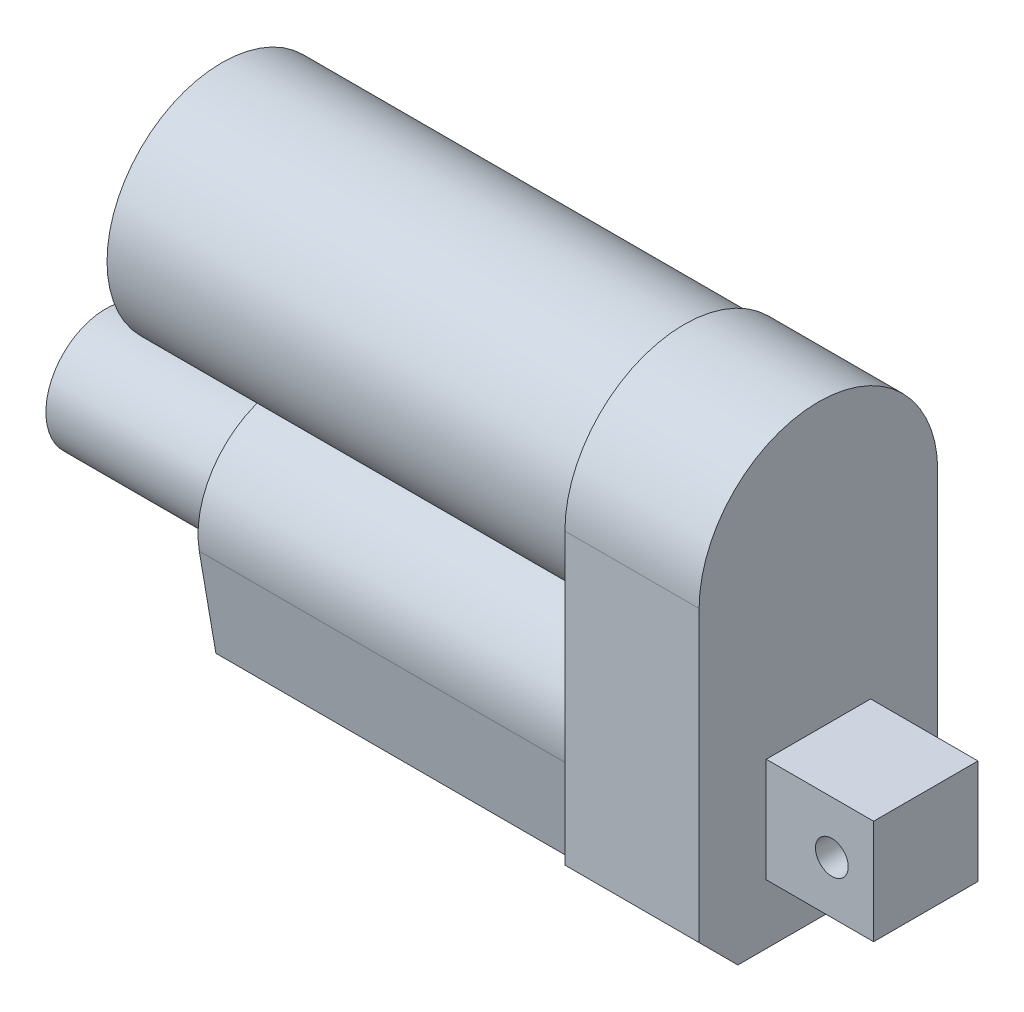
ISO-10303-21;
HEADER;
FILE_DESCRIPTION(('STEP AP214'),'2;1');
FILE_NAME('part.step','',(''),(''),'','','');
FILE_SCHEMA(('AUTOMOTIVE_DESIGN { 1 0 10303 214 1 1 1 1 }'));
ENDSEC;
DATA;
#1=APPLICATION_CONTEXT('core data for automotive mechanical design processes');
#2=APPLICATION_PROTOCOL_DEFINITION('international standard','automotive_design',2000,#1);
#3=PRODUCT_CONTEXT('',#1,'mechanical');
#4=PRODUCT('Part','Part','',(#3));
#5=PRODUCT_RELATED_PRODUCT_CATEGORY('part','',(#4));
#6=PRODUCT_DEFINITION_FORMATION('','',#4);
#7=PRODUCT_DEFINITION_CONTEXT('part definition',#1,'design');
#8=PRODUCT_DEFINITION('design','',#6,#7);
#9=PRODUCT_DEFINITION_SHAPE('','',#8);
#10=(LENGTH_UNIT() NAMED_UNIT(*) SI_UNIT(.MILLI.,.METRE.));
#11=(NAMED_UNIT(*) PLANE_ANGLE_UNIT() SI_UNIT($,.RADIAN.));
#12=(NAMED_UNIT(*) SI_UNIT($,.STERADIAN.) SOLID_ANGLE_UNIT());
#13=UNCERTAINTY_MEASURE_WITH_UNIT(LENGTH_MEASURE(1.E-05),#10,'distance_accuracy_value','');
#14=(GEOMETRIC_REPRESENTATION_CONTEXT(3) GLOBAL_UNCERTAINTY_ASSIGNED_CONTEXT((#13)) GLOBAL_UNIT_ASSIGNED_CONTEXT((#10,
#11,#12)) REPRESENTATION_CONTEXT('',''));
#15=CARTESIAN_POINT('',(0.,0.,0.));
#16=DIRECTION('',(0.,0.,1.));
#17=DIRECTION('',(1.,0.,0.));
#18=AXIS2_PLACEMENT_3D('',#15,#16,#17);
#19=CARTESIAN_POINT('',(0.,0.,0.));
#20=DIRECTION('',(1.,0.,0.));
#21=DIRECTION('',(0.,0.,-1.));
#22=AXIS2_PLACEMENT_3D('',#19,#20,#21);
#23=PLANE('',#22);
#24=CARTESIAN_POINT('',(0.,36.25,0.));
#25=DIRECTION('',(1.,0.,0.));
#26=DIRECTION('',(0.,0.,-1.));
#27=AXIS2_PLACEMENT_3D('',#24,#25,#26);
#28=CIRCLE('',#27,19.25);
#29=CARTESIAN_POINT('',(0.,36.25,-19.25));
#30=VERTEX_POINT('',#29);
#31=EDGE_CURVE('E39',#30,#30,#28,.F.);
#32=ORIENTED_EDGE('',*,*,#31,.F.);
#33=EDGE_LOOP('',(#32));
#34=FACE_BOUND('',#33,.T.);
#35=DIRECTION('',(0.,-0.985576396125463,0.169231106479704));
#36=VECTOR('',#35,1.);
#37=CARTESIAN_POINT('',(0.,-2.53846659719557,-14.7836459418819));
#38=LINE('',#37,#36);
#39=CARTESIAN_POINT('',(0.,-2.53846659719557,-14.7836459418819));
#40=VERTEX_POINT('',#39);
#41=CARTESIAN_POINT('',(0.,-18.75,-12.));
#42=VERTEX_POINT('',#41);
#43=EDGE_CURVE('E51',#40,#42,#38,.T.);
#44=ORIENTED_EDGE('',*,*,#43,.F.);
#45=CARTESIAN_POINT('',(0.,0.,0.));
#46=DIRECTION('',(-1.,0.,0.));
#47=DIRECTION('',(0.,0.,1.));
#48=AXIS2_PLACEMENT_3D('',#45,#46,#47);
#49=CIRCLE('',#48,15.);
#50=CARTESIAN_POINT('',(0.,-2.53846659719556,14.7836459418819));
#51=VERTEX_POINT('',#50);
#52=EDGE_CURVE('E286',#51,#40,#49,.T.);
#53=ORIENTED_EDGE('',*,*,#52,.F.);
#54=DIRECTION('',(0.,0.985576396125463,0.169231106479704));
#55=VECTOR('',#54,1.);
#56=CARTESIAN_POINT('',(0.,-2.53846659719556,14.7836459418819));
#57=LINE('',#56,#55);
#58=CARTESIAN_POINT('',(0.,-18.75,12.));
#59=VERTEX_POINT('',#58);
#60=EDGE_CURVE('E285',#59,#51,#57,.T.);
#61=ORIENTED_EDGE('',*,*,#60,.F.);
#62=DIRECTION('',(0.,0.,-1.));
#63=VECTOR('',#62,1.);
#64=CARTESIAN_POINT('',(0.,-18.75,0.));
#65=LINE('',#64,#63);
#66=CARTESIAN_POINT('',(0.,-18.75,13.5));
#67=VERTEX_POINT('',#66);
#68=EDGE_CURVE('E160',#67,#59,#65,.T.);
#69=ORIENTED_EDGE('',*,*,#68,.F.);
#70=DIRECTION('',(0.,-0.707106781186546,-0.707106781186549));
#71=VECTOR('',#70,1.);
#72=CARTESIAN_POINT('',(0.,-16.125,16.125));
#73=LINE('',#72,#71);
#74=CARTESIAN_POINT('',(0.,-12.25,20.));
#75=VERTEX_POINT('',#74);
#76=EDGE_CURVE('E221',#75,#67,#73,.T.);
#77=ORIENTED_EDGE('',*,*,#76,.F.);
#78=DIRECTION('',(0.,-1.,0.));
#79=VECTOR('',#78,1.);
#80=CARTESIAN_POINT('',(0.,0.,20.));
#81=LINE('',#80,#79);
#82=CARTESIAN_POINT('',(0.,36.25,20.));
#83=VERTEX_POINT('',#82);
#84=EDGE_CURVE('E219',#83,#75,#81,.T.);
#85=ORIENTED_EDGE('',*,*,#84,.F.);
#86=CARTESIAN_POINT('',(0.,36.25,0.));
#87=DIRECTION('',(1.,0.,0.));
#88=DIRECTION('',(0.,0.,-1.));
#89=AXIS2_PLACEMENT_3D('',#86,#87,#88);
#90=CIRCLE('',#89,20.);
#91=CARTESIAN_POINT('',(0.,36.25,-20.));
#92=VERTEX_POINT('',#91);
#93=EDGE_CURVE('E200',#92,#83,#90,.T.);
#94=ORIENTED_EDGE('',*,*,#93,.F.);
#95=DIRECTION('',(0.,1.,0.));
#96=VECTOR('',#95,1.);
#97=CARTESIAN_POINT('',(0.,0.,-20.));
#98=LINE('',#97,#96);
#99=CARTESIAN_POINT('',(0.,-12.25,-20.));
#100=VERTEX_POINT('',#99);
#101=EDGE_CURVE('E205',#100,#92,#98,.T.);
#102=ORIENTED_EDGE('',*,*,#101,.F.);
#103=DIRECTION('',(0.,-0.707106781186546,0.707106781186549));
#104=VECTOR('',#103,1.);
#105=CARTESIAN_POINT('',(0.,-16.125,-16.125));
#106=LINE('',#105,#104);
#107=CARTESIAN_POINT('',(0.,-18.75,-13.5));
#108=VERTEX_POINT('',#107);
#109=EDGE_CURVE('E224',#100,#108,#106,.T.);
#110=ORIENTED_EDGE('',*,*,#109,.T.);
#111=EDGE_CURVE('E56',#42,#108,#65,.T.);
#112=ORIENTED_EDGE('',*,*,#111,.F.);
#113=EDGE_LOOP('',(#44,#53,#61,#69,#77,#85,#94,#102,#110,#112));
#114=FACE_BOUND('',#113,.T.);
#115=ADVANCED_FACE('F35',(#34,#114),#23,.F.);
#116=CARTESIAN_POINT('',(22.5,0.,0.));
#117=DIRECTION('',(1.,0.,0.));
#118=DIRECTION('',(0.,0.,-1.));
#119=AXIS2_PLACEMENT_3D('',#116,#117,#118);
#120=PLANE('',#119);
#121=CARTESIAN_POINT('',(22.5,36.25,0.));
#122=DIRECTION('',(1.,0.,0.));
#123=DIRECTION('',(0.,0.,-1.));
#124=AXIS2_PLACEMENT_3D('',#121,#122,#123);
#125=CIRCLE('',#124,20.);
#126=CARTESIAN_POINT('',(22.5,36.25,-20.));
#127=VERTEX_POINT('',#126);
#128=CARTESIAN_POINT('',(22.5,36.25,20.));
#129=VERTEX_POINT('',#128);
#130=EDGE_CURVE('E201',#127,#129,#125,.T.);
#131=ORIENTED_EDGE('',*,*,#130,.T.);
#132=DIRECTION('',(0.,-1.,0.));
#133=VECTOR('',#132,1.);
#134=CARTESIAN_POINT('',(22.5,0.,20.));
#135=LINE('',#134,#133);
#136=CARTESIAN_POINT('',(22.5,-12.25,20.));
#137=VERTEX_POINT('',#136);
#138=EDGE_CURVE('E204',#129,#137,#135,.T.);
#139=ORIENTED_EDGE('',*,*,#138,.T.);
#140=DIRECTION('',(0.,-0.707106781186546,-0.707106781186549));
#141=VECTOR('',#140,1.);
#142=CARTESIAN_POINT('',(22.5,-16.125,16.125));
#143=LINE('',#142,#141);
#144=CARTESIAN_POINT('',(22.5,-18.75,13.5));
#145=VERTEX_POINT('',#144);
#146=EDGE_CURVE('E207',#137,#145,#143,.T.);
#147=ORIENTED_EDGE('',*,*,#146,.T.);
#148=DIRECTION('',(0.,0.,-1.));
#149=VECTOR('',#148,1.);
#150=CARTESIAN_POINT('',(22.5,-18.75,0.));
#151=LINE('',#150,#149);
#152=CARTESIAN_POINT('',(22.5,-18.75,-13.5));
#153=VERTEX_POINT('',#152);
#154=EDGE_CURVE('E209',#145,#153,#151,.T.);
#155=ORIENTED_EDGE('',*,*,#154,.T.);
#156=DIRECTION('',(0.,-0.707106781186546,0.707106781186549));
#157=VECTOR('',#156,1.);
#158=CARTESIAN_POINT('',(22.5,-16.125,-16.125));
#159=LINE('',#158,#157);
#160=CARTESIAN_POINT('',(22.5,-12.25,-20.));
#161=VERTEX_POINT('',#160);
#162=EDGE_CURVE('E211',#161,#153,#159,.T.);
#163=ORIENTED_EDGE('',*,*,#162,.F.);
#164=DIRECTION('',(0.,1.,0.));
#165=VECTOR('',#164,1.);
#166=CARTESIAN_POINT('',(22.5,0.,-20.));
#167=LINE('',#166,#165);
#168=EDGE_CURVE('E214',#161,#127,#167,.T.);
#169=ORIENTED_EDGE('',*,*,#168,.T.);
#170=EDGE_LOOP('',(#131,#139,#147,#155,#163,#169));
#171=FACE_BOUND('',#170,.T.);
#172=DIRECTION('',(0.,0.,1.));
#173=VECTOR('',#172,1.);
#174=CARTESIAN_POINT('',(22.5,8.75,-8.75));
#175=LINE('',#174,#173);
#176=CARTESIAN_POINT('',(22.5,8.75,-8.75));
#177=VERTEX_POINT('',#176);
#178=CARTESIAN_POINT('',(22.5,8.75,8.75000000000001));
#179=VERTEX_POINT('',#178);
#180=EDGE_CURVE('E185',#177,#179,#175,.T.);
#181=ORIENTED_EDGE('',*,*,#180,.F.);
#182=DIRECTION('',(0.,1.,0.));
#183=VECTOR('',#182,1.);
#184=CARTESIAN_POINT('',(22.5,8.75,-8.75));
#185=LINE('',#184,#183);
#186=CARTESIAN_POINT('',(22.5,-8.75,-8.75));
#187=VERTEX_POINT('',#186);
#188=EDGE_CURVE('E171',#187,#177,#185,.T.);
#189=ORIENTED_EDGE('',*,*,#188,.F.);
#190=DIRECTION('',(0.,0.,-1.));
#191=VECTOR('',#190,1.);
#192=CARTESIAN_POINT('',(22.5,-8.75,-8.75));
#193=LINE('',#192,#191);
#194=CARTESIAN_POINT('',(22.5,-8.75,8.75));
#195=VERTEX_POINT('',#194);
#196=EDGE_CURVE('E176',#195,#187,#193,.T.);
#197=ORIENTED_EDGE('',*,*,#196,.F.);
#198=DIRECTION('',(0.,-1.,0.));
#199=VECTOR('',#198,1.);
#200=CARTESIAN_POINT('',(22.5,8.75,8.75000000000001));
#201=LINE('',#200,#199);
#202=EDGE_CURVE('E187',#179,#195,#201,.T.);
#203=ORIENTED_EDGE('',*,*,#202,.F.);
#204=EDGE_LOOP('',(#181,#189,#197,#203));
#205=FACE_BOUND('',#204,.T.);
#206=ADVANCED_FACE('F249',(#171,#205),#120,.T.);
#207=CARTESIAN_POINT('',(22.5,36.25,0.));
#208=DIRECTION('',(-1.,0.,0.));
#209=DIRECTION('',(0.,0.,1.));
#210=AXIS2_PLACEMENT_3D('',#207,#208,#209);
#211=CYLINDRICAL_SURFACE('',#210,20.);
#212=ORIENTED_EDGE('',*,*,#93,.T.);
#213=DIRECTION('',(-1.,0.,0.));
#214=VECTOR('',#213,1.);
#215=CARTESIAN_POINT('',(22.5,36.25,20.));
#216=LINE('',#215,#214);
#217=EDGE_CURVE('E239',#129,#83,#216,.T.);
#218=ORIENTED_EDGE('',*,*,#217,.F.);
#219=ORIENTED_EDGE('',*,*,#130,.F.);
#220=DIRECTION('',(-1.,0.,0.));
#221=VECTOR('',#220,1.);
#222=CARTESIAN_POINT('',(22.5,36.25,-20.));
#223=LINE('',#222,#221);
#224=EDGE_CURVE('E216',#127,#92,#223,.T.);
#225=ORIENTED_EDGE('',*,*,#224,.T.);
#226=EDGE_LOOP('',(#212,#218,#219,#225));
#227=FACE_BOUND('',#226,.T.);
#228=ADVANCED_FACE('F37',(#227),#211,.T.);
#229=CARTESIAN_POINT('',(22.5,0.,20.));
#230=DIRECTION('',(0.,0.,-1.));
#231=DIRECTION('',(0.,1.,0.));
#232=AXIS2_PLACEMENT_3D('',#229,#230,#231);
#233=PLANE('',#232);
#234=ORIENTED_EDGE('',*,*,#84,.T.);
#235=DIRECTION('',(-1.,0.,0.));
#236=VECTOR('',#235,1.);
#237=CARTESIAN_POINT('',(22.5,-12.25,20.));
#238=LINE('',#237,#236);
#239=EDGE_CURVE('E236',#137,#75,#238,.T.);
#240=ORIENTED_EDGE('',*,*,#239,.F.);
#241=ORIENTED_EDGE('',*,*,#138,.F.);
#242=ORIENTED_EDGE('',*,*,#217,.T.);
#243=EDGE_LOOP('',(#234,#240,#241,#242));
#244=FACE_BOUND('',#243,.T.);
#245=ADVANCED_FACE('F273',(#244),#233,.F.);
#246=CARTESIAN_POINT('',(22.5,-16.125,16.125));
#247=DIRECTION('',(0.,0.707106781186549,-0.707106781186546));
#248=DIRECTION('',(0.,0.707106781186546,0.707106781186549));
#249=AXIS2_PLACEMENT_3D('',#246,#247,#248);
#250=PLANE('',#249);
#251=ORIENTED_EDGE('',*,*,#76,.T.);
#252=DIRECTION('',(-1.,0.,0.));
#253=VECTOR('',#252,1.);
#254=CARTESIAN_POINT('',(22.5,-18.75,13.5));
#255=LINE('',#254,#253);
#256=EDGE_CURVE('E234',#145,#67,#255,.T.);
#257=ORIENTED_EDGE('',*,*,#256,.F.);
#258=ORIENTED_EDGE('',*,*,#146,.F.);
#259=ORIENTED_EDGE('',*,*,#239,.T.);
#260=EDGE_LOOP('',(#251,#257,#258,#259));
#261=FACE_BOUND('',#260,.T.);
#262=ADVANCED_FACE('F271',(#261),#250,.F.);
#263=CARTESIAN_POINT('',(22.5,-18.75,0.));
#264=DIRECTION('',(0.,1.,0.));
#265=DIRECTION('',(0.,0.,1.));
#266=AXIS2_PLACEMENT_3D('',#263,#264,#265);
#267=PLANE('',#266);
#268=ORIENTED_EDGE('',*,*,#68,.T.);
#269=DIRECTION('',(1.,0.,0.));
#270=VECTOR('',#269,1.);
#271=CARTESIAN_POINT('',(-66.5,-18.75,12.));
#272=LINE('',#271,#270);
#273=CARTESIAN_POINT('',(-66.5,-18.75,12.));
#274=VERTEX_POINT('',#273);
#275=EDGE_CURVE('E140',#274,#59,#272,.T.);
#276=ORIENTED_EDGE('',*,*,#275,.F.);
#277=DIRECTION('',(0.,0.,1.));
#278=VECTOR('',#277,1.);
#279=CARTESIAN_POINT('',(-66.5,-18.75,0.));
#280=LINE('',#279,#278);
#281=CARTESIAN_POINT('',(-66.5,-18.75,-12.));
#282=VERTEX_POINT('',#281);
#283=EDGE_CURVE('E146',#282,#274,#280,.T.);
#284=ORIENTED_EDGE('',*,*,#283,.F.);
#285=DIRECTION('',(1.,0.,0.));
#286=VECTOR('',#285,1.);
#287=CARTESIAN_POINT('',(-66.5,-18.75,-12.));
#288=LINE('',#287,#286);
#289=EDGE_CURVE('E297',#282,#42,#288,.T.);
#290=ORIENTED_EDGE('',*,*,#289,.T.);
#291=ORIENTED_EDGE('',*,*,#111,.T.);
#292=DIRECTION('',(-1.,0.,0.));
#293=VECTOR('',#292,1.);
#294=CARTESIAN_POINT('',(22.5,-18.75,-13.5));
#295=LINE('',#294,#293);
#296=EDGE_CURVE('E231',#153,#108,#295,.T.);
#297=ORIENTED_EDGE('',*,*,#296,.F.);
#298=ORIENTED_EDGE('',*,*,#154,.F.);
#299=ORIENTED_EDGE('',*,*,#256,.T.);
#300=EDGE_LOOP('',(#268,#276,#284,#290,#291,#297,#298,#299));
#301=FACE_BOUND('',#300,.T.);
#302=ADVANCED_FACE('F157',(#301),#267,.F.);
#303=CARTESIAN_POINT('',(22.5,-16.125,-16.125));
#304=DIRECTION('',(0.,-0.707106781186549,-0.707106781186546));
#305=DIRECTION('',(0.,0.707106781186546,-0.707106781186549));
#306=AXIS2_PLACEMENT_3D('',#303,#304,#305);
#307=PLANE('',#306);
#308=ORIENTED_EDGE('',*,*,#109,.F.);
#309=DIRECTION('',(-1.,0.,0.));
#310=VECTOR('',#309,1.);
#311=CARTESIAN_POINT('',(22.5,-12.25,-20.));
#312=LINE('',#311,#310);
#313=EDGE_CURVE('E229',#161,#100,#312,.T.);
#314=ORIENTED_EDGE('',*,*,#313,.F.);
#315=ORIENTED_EDGE('',*,*,#162,.T.);
#316=ORIENTED_EDGE('',*,*,#296,.T.);
#317=EDGE_LOOP('',(#308,#314,#315,#316));
#318=FACE_BOUND('',#317,.T.);
#319=ADVANCED_FACE('F264',(#318),#307,.T.);
#320=CARTESIAN_POINT('',(22.5,0.,-20.));
#321=DIRECTION('',(0.,0.,1.));
#322=DIRECTION('',(0.,-1.,0.));
#323=AXIS2_PLACEMENT_3D('',#320,#321,#322);
#324=PLANE('',#323);
#325=ORIENTED_EDGE('',*,*,#101,.T.);
#326=ORIENTED_EDGE('',*,*,#224,.F.);
#327=ORIENTED_EDGE('',*,*,#168,.F.);
#328=ORIENTED_EDGE('',*,*,#313,.T.);
#329=EDGE_LOOP('',(#325,#326,#327,#328));
#330=FACE_BOUND('',#329,.T.);
#331=ADVANCED_FACE('F260',(#330),#324,.F.);
#332=CARTESIAN_POINT('',(40.5,8.75,-8.75));
#333=DIRECTION('',(0.,0.,1.));
#334=DIRECTION('',(0.,-1.,0.));
#335=AXIS2_PLACEMENT_3D('',#332,#333,#334);
#336=PLANE('',#335);
#337=CARTESIAN_POINT('',(33.5,0.,-8.75));
#338=DIRECTION('',(0.,0.,1.));
#339=DIRECTION('',(0.,-1.,0.));
#340=AXIS2_PLACEMENT_3D('',#337,#338,#339);
#341=CIRCLE('',#340,2.74999999999999);
#342=CARTESIAN_POINT('',(33.5,-2.75,-8.75));
#343=VERTEX_POINT('',#342);
#344=EDGE_CURVE('E164',#343,#343,#341,.T.);
#345=ORIENTED_EDGE('',*,*,#344,.T.);
#346=EDGE_LOOP('',(#345));
#347=FACE_BOUND('',#346,.T.);
#348=ORIENTED_EDGE('',*,*,#188,.T.);
#349=DIRECTION('',(-1.,0.,0.));
#350=VECTOR('',#349,1.);
#351=CARTESIAN_POINT('',(40.5,8.75,-8.75));
#352=LINE('',#351,#350);
#353=CARTESIAN_POINT('',(40.5,8.75,-8.75));
#354=VERTEX_POINT('',#353);
#355=EDGE_CURVE('E198',#354,#177,#352,.T.);
#356=ORIENTED_EDGE('',*,*,#355,.F.);
#357=DIRECTION('',(0.,1.,0.));
#358=VECTOR('',#357,1.);
#359=CARTESIAN_POINT('',(40.5,8.75,-8.75));
#360=LINE('',#359,#358);
#361=CARTESIAN_POINT('',(40.5,-8.75,-8.75));
#362=VERTEX_POINT('',#361);
#363=EDGE_CURVE('E172',#362,#354,#360,.T.);
#364=ORIENTED_EDGE('',*,*,#363,.F.);
#365=DIRECTION('',(-1.,0.,0.));
#366=VECTOR('',#365,1.);
#367=CARTESIAN_POINT('',(40.5,-8.75,-8.75));
#368=LINE('',#367,#366);
#369=EDGE_CURVE('E182',#362,#187,#368,.T.);
#370=ORIENTED_EDGE('',*,*,#369,.T.);
#371=EDGE_LOOP('',(#348,#356,#364,#370));
#372=FACE_BOUND('',#371,.T.);
#373=ADVANCED_FACE('F263',(#347,#372),#336,.F.);
#374=CARTESIAN_POINT('',(40.5,8.75,-8.75));
#375=DIRECTION('',(0.,-1.,0.));
#376=DIRECTION('',(0.,0.,-1.));
#377=AXIS2_PLACEMENT_3D('',#374,#375,#376);
#378=PLANE('',#377);
#379=ORIENTED_EDGE('',*,*,#180,.T.);
#380=DIRECTION('',(-1.,0.,0.));
#381=VECTOR('',#380,1.);
#382=CARTESIAN_POINT('',(40.5,8.75,8.75000000000001));
#383=LINE('',#382,#381);
#384=CARTESIAN_POINT('',(40.5,8.75,8.75000000000001));
#385=VERTEX_POINT('',#384);
#386=EDGE_CURVE('E195',#385,#179,#383,.T.);
#387=ORIENTED_EDGE('',*,*,#386,.F.);
#388=DIRECTION('',(0.,0.,1.));
#389=VECTOR('',#388,1.);
#390=CARTESIAN_POINT('',(40.5,8.75,-8.75));
#391=LINE('',#390,#389);
#392=EDGE_CURVE('E175',#354,#385,#391,.T.);
#393=ORIENTED_EDGE('',*,*,#392,.F.);
#394=ORIENTED_EDGE('',*,*,#355,.T.);
#395=EDGE_LOOP('',(#379,#387,#393,#394));
#396=FACE_BOUND('',#395,.T.);
#397=ADVANCED_FACE('F347',(#396),#378,.F.);
#398=CARTESIAN_POINT('',(40.5,8.75,8.75000000000001));
#399=DIRECTION('',(0.,0.,-1.));
#400=DIRECTION('',(0.,1.,0.));
#401=AXIS2_PLACEMENT_3D('',#398,#399,#400);
#402=PLANE('',#401);
#403=CARTESIAN_POINT('',(33.5,0.,8.75));
#404=DIRECTION('',(0.,0.,-1.));
#405=DIRECTION('',(0.,1.,0.));
#406=AXIS2_PLACEMENT_3D('',#403,#404,#405);
#407=CIRCLE('',#406,2.74999999999999);
#408=CARTESIAN_POINT('',(33.5,2.74999999999999,8.75));
#409=VERTEX_POINT('',#408);
#410=EDGE_CURVE('E161',#409,#409,#407,.T.);
#411=ORIENTED_EDGE('',*,*,#410,.T.);
#412=EDGE_LOOP('',(#411));
#413=FACE_BOUND('',#412,.T.);
#414=ORIENTED_EDGE('',*,*,#202,.T.);
#415=DIRECTION('',(-1.,0.,0.));
#416=VECTOR('',#415,1.);
#417=CARTESIAN_POINT('',(40.5,-8.75,8.75));
#418=LINE('',#417,#416);
#419=CARTESIAN_POINT('',(40.5,-8.75,8.75));
#420=VERTEX_POINT('',#419);
#421=EDGE_CURVE('E193',#420,#195,#418,.T.);
#422=ORIENTED_EDGE('',*,*,#421,.F.);
#423=DIRECTION('',(0.,-1.,0.));
#424=VECTOR('',#423,1.);
#425=CARTESIAN_POINT('',(40.5,8.75,8.75000000000001));
#426=LINE('',#425,#424);
#427=EDGE_CURVE('E178',#385,#420,#426,.T.);
#428=ORIENTED_EDGE('',*,*,#427,.F.);
#429=ORIENTED_EDGE('',*,*,#386,.T.);
#430=EDGE_LOOP('',(#414,#422,#428,#429));
#431=FACE_BOUND('',#430,.T.);
#432=ADVANCED_FACE('F343',(#413,#431),#402,.F.);
#433=CARTESIAN_POINT('',(40.5,-8.75,-8.75));
#434=DIRECTION('',(0.,1.,0.));
#435=DIRECTION('',(0.,0.,1.));
#436=AXIS2_PLACEMENT_3D('',#433,#434,#435);
#437=PLANE('',#436);
#438=ORIENTED_EDGE('',*,*,#196,.T.);
#439=ORIENTED_EDGE('',*,*,#369,.F.);
#440=DIRECTION('',(0.,0.,-1.));
#441=VECTOR('',#440,1.);
#442=CARTESIAN_POINT('',(40.5,-8.75,-8.75));
#443=LINE('',#442,#441);
#444=EDGE_CURVE('E180',#420,#362,#443,.T.);
#445=ORIENTED_EDGE('',*,*,#444,.F.);
#446=ORIENTED_EDGE('',*,*,#421,.T.);
#447=EDGE_LOOP('',(#438,#439,#445,#446));
#448=FACE_BOUND('',#447,.T.);
#449=ADVANCED_FACE('F339',(#448),#437,.F.);
#450=CARTESIAN_POINT('',(40.5,0.,0.));
#451=DIRECTION('',(-1.,0.,0.));
#452=DIRECTION('',(0.,0.,1.));
#453=AXIS2_PLACEMENT_3D('',#450,#451,#452);
#454=PLANE('',#453);
#455=ORIENTED_EDGE('',*,*,#363,.T.);
#456=ORIENTED_EDGE('',*,*,#392,.T.);
#457=ORIENTED_EDGE('',*,*,#427,.T.);
#458=ORIENTED_EDGE('',*,*,#444,.T.);
#459=EDGE_LOOP('',(#455,#456,#457,#458));
#460=FACE_BOUND('',#459,.T.);
#461=ADVANCED_FACE('F335',(#460),#454,.F.);
#462=CARTESIAN_POINT('',(33.5,0.,-20.));
#463=DIRECTION('',(0.,0.,1.));
#464=DIRECTION('',(1.,0.,0.));
#465=AXIS2_PLACEMENT_3D('',#462,#463,#464);
#466=CYLINDRICAL_SURFACE('',#465,2.74999999999999);
#467=ORIENTED_EDGE('',*,*,#410,.F.);
#468=EDGE_LOOP('',(#467));
#469=FACE_BOUND('',#468,.T.);
#470=ORIENTED_EDGE('',*,*,#344,.F.);
#471=EDGE_LOOP('',(#470));
#472=FACE_BOUND('',#471,.T.);
#473=ADVANCED_FACE('F332',(#469,#472),#466,.F.);
#474=CARTESIAN_POINT('',(-66.5,-2.53846659719556,14.7836459418819));
#475=DIRECTION('',(0.,0.169231106479704,-0.985576396125463));
#476=DIRECTION('',(0.,0.985576396125463,0.169231106479704));
#477=AXIS2_PLACEMENT_3D('',#474,#475,#476);
#478=PLANE('',#477);
#479=ORIENTED_EDGE('',*,*,#60,.T.);
#480=DIRECTION('',(1.,0.,0.));
#481=VECTOR('',#480,1.);
#482=CARTESIAN_POINT('',(-66.5,-2.53846659719556,14.7836459418819));
#483=LINE('',#482,#481);
#484=CARTESIAN_POINT('',(-66.5,-2.53846659719556,14.7836459418819));
#485=VERTEX_POINT('',#484);
#486=EDGE_CURVE('E142',#485,#51,#483,.T.);
#487=ORIENTED_EDGE('',*,*,#486,.F.);
#488=DIRECTION('',(0.,0.985576396125463,0.169231106479704));
#489=VECTOR('',#488,1.);
#490=CARTESIAN_POINT('',(-66.5,-2.53846659719556,14.7836459418819));
#491=LINE('',#490,#489);
#492=EDGE_CURVE('E135',#274,#485,#491,.T.);
#493=ORIENTED_EDGE('',*,*,#492,.F.);
#494=ORIENTED_EDGE('',*,*,#275,.T.);
#495=EDGE_LOOP('',(#479,#487,#493,#494));
#496=FACE_BOUND('',#495,.T.);
#497=ADVANCED_FACE('F138',(#496),#478,.F.);
#498=CARTESIAN_POINT('',(-66.5,0.,0.));
#499=DIRECTION('',(1.,0.,0.));
#500=DIRECTION('',(0.,0.,-1.));
#501=AXIS2_PLACEMENT_3D('',#498,#499,#500);
#502=CYLINDRICAL_SURFACE('',#501,15.);
#503=ORIENTED_EDGE('',*,*,#52,.T.);
#504=DIRECTION('',(1.,0.,0.));
#505=VECTOR('',#504,1.);
#506=CARTESIAN_POINT('',(-66.5,-2.53846659719557,-14.7836459418819));
#507=LINE('',#506,#505);
#508=CARTESIAN_POINT('',(-66.5,-2.53846659719557,-14.7836459418819));
#509=VERTEX_POINT('',#508);
#510=EDGE_CURVE('E165',#509,#40,#507,.T.);
#511=ORIENTED_EDGE('',*,*,#510,.F.);
#512=CARTESIAN_POINT('',(-66.5,0.,0.));
#513=DIRECTION('',(-1.,0.,0.));
#514=DIRECTION('',(0.,0.,1.));
#515=AXIS2_PLACEMENT_3D('',#512,#513,#514);
#516=CIRCLE('',#515,15.);
#517=EDGE_CURVE('E145',#485,#509,#516,.T.);
#518=ORIENTED_EDGE('',*,*,#517,.F.);
#519=ORIENTED_EDGE('',*,*,#486,.T.);
#520=EDGE_LOOP('',(#503,#511,#518,#519));
#521=FACE_BOUND('',#520,.T.);
#522=ADVANCED_FACE('F303',(#521),#502,.T.);
#523=CARTESIAN_POINT('',(-66.5,-2.53846659719557,-14.7836459418819));
#524=DIRECTION('',(0.,0.169231106479704,0.985576396125463));
#525=DIRECTION('',(0.,-0.985576396125463,0.169231106479704));
#526=AXIS2_PLACEMENT_3D('',#523,#524,#525);
#527=PLANE('',#526);
#528=ORIENTED_EDGE('',*,*,#43,.T.);
#529=ORIENTED_EDGE('',*,*,#289,.F.);
#530=DIRECTION('',(0.,-0.985576396125463,0.169231106479704));
#531=VECTOR('',#530,1.);
#532=CARTESIAN_POINT('',(-66.5,-2.53846659719557,-14.7836459418819));
#533=LINE('',#532,#531);
#534=EDGE_CURVE('E151',#509,#282,#533,.T.);
#535=ORIENTED_EDGE('',*,*,#534,.F.);
#536=ORIENTED_EDGE('',*,*,#510,.T.);
#537=EDGE_LOOP('',(#528,#529,#535,#536));
#538=FACE_BOUND('',#537,.T.);
#539=ADVANCED_FACE('F301',(#538),#527,.F.);
#540=CARTESIAN_POINT('',(-66.5,0.,0.));
#541=DIRECTION('',(-1.,0.,0.));
#542=DIRECTION('',(0.,0.,1.));
#543=AXIS2_PLACEMENT_3D('',#540,#541,#542);
#544=PLANE('',#543);
#545=CARTESIAN_POINT('',(-66.5,0.,0.));
#546=DIRECTION('',(-1.,0.,0.));
#547=DIRECTION('',(0.,0.,1.));
#548=AXIS2_PLACEMENT_3D('',#545,#546,#547);
#549=CIRCLE('',#548,10.);
#550=CARTESIAN_POINT('',(-66.5,0.,-10.));
#551=VERTEX_POINT('',#550);
#552=EDGE_CURVE('E11',#551,#551,#549,.T.);
#553=ORIENTED_EDGE('',*,*,#552,.F.);
#554=EDGE_LOOP('',(#553));
#555=FACE_BOUND('',#554,.T.);
#556=ORIENTED_EDGE('',*,*,#283,.T.);
#557=ORIENTED_EDGE('',*,*,#492,.T.);
#558=ORIENTED_EDGE('',*,*,#517,.T.);
#559=ORIENTED_EDGE('',*,*,#534,.T.);
#560=EDGE_LOOP('',(#556,#557,#558,#559));
#561=FACE_BOUND('',#560,.T.);
#562=ADVANCED_FACE('F149',(#555,#561),#544,.T.);
#563=CARTESIAN_POINT('',(-77.5,36.25,0.));
#564=DIRECTION('',(1.,0.,0.));
#565=DIRECTION('',(0.,0.,-1.));
#566=AXIS2_PLACEMENT_3D('',#563,#564,#565);
#567=CYLINDRICAL_SURFACE('',#566,19.25);
#568=CARTESIAN_POINT('',(-77.5,36.25,0.));
#569=DIRECTION('',(-1.,0.,0.));
#570=DIRECTION('',(0.,0.,1.));
#571=AXIS2_PLACEMENT_3D('',#568,#569,#570);
#572=CIRCLE('',#571,19.25);
#573=CARTESIAN_POINT('',(-77.5,36.25,19.25));
#574=VERTEX_POINT('',#573);
#575=EDGE_CURVE('E287',#574,#574,#572,.T.);
#576=ORIENTED_EDGE('',*,*,#575,.F.);
#577=EDGE_LOOP('',(#576));
#578=FACE_BOUND('',#577,.T.);
#579=ORIENTED_EDGE('',*,*,#31,.T.);
#580=EDGE_LOOP('',(#579));
#581=FACE_BOUND('',#580,.T.);
#582=ADVANCED_FACE('F246',(#578,#581),#567,.T.);
#583=CARTESIAN_POINT('',(-77.5,36.25,0.));
#584=DIRECTION('',(-1.,0.,0.));
#585=DIRECTION('',(0.,0.,1.));
#586=AXIS2_PLACEMENT_3D('',#583,#584,#585);
#587=PLANE('',#586);
#588=ORIENTED_EDGE('',*,*,#575,.T.);
#589=EDGE_LOOP('',(#588));
#590=FACE_BOUND('',#589,.T.);
#591=ADVANCED_FACE('F313',(#590),#587,.T.);
#592=CARTESIAN_POINT('',(-97.,0.,0.));
#593=DIRECTION('',(1.,0.,0.));
#594=DIRECTION('',(0.,0.,-1.));
#595=AXIS2_PLACEMENT_3D('',#592,#593,#594);
#596=CYLINDRICAL_SURFACE('',#595,10.);
#597=CARTESIAN_POINT('',(-97.,0.,0.));
#598=DIRECTION('',(-1.,0.,0.));
#599=DIRECTION('',(0.,0.,1.));
#600=AXIS2_PLACEMENT_3D('',#597,#598,#599);
#601=CIRCLE('',#600,10.);
#602=CARTESIAN_POINT('',(-97.,0.,-10.));
#603=VERTEX_POINT('',#602);
#604=EDGE_CURVE('E291',#603,#603,#601,.T.);
#605=CARTESIAN_POINT('',(-97.,0.,-10.));
#606=CARTESIAN_POINT('',(-96.6822916666667,0.,-10.));
#607=CARTESIAN_POINT('',(-96.3645833333333,0.,-10.));
#608=CARTESIAN_POINT('',(-95.7291666666667,0.,-10.));
#609=CARTESIAN_POINT('',(-95.4114583333333,0.,-10.));
#610=CARTESIAN_POINT('',(-94.7760416666667,0.,-10.));
#611=CARTESIAN_POINT('',(-94.4583333333333,0.,-10.));
#612=CARTESIAN_POINT('',(-93.8229166666667,0.,-10.));
#613=CARTESIAN_POINT('',(-93.5052083333333,0.,-10.));
#614=CARTESIAN_POINT('',(-92.8697916666667,0.,-10.));
#615=CARTESIAN_POINT('',(-92.5520833333333,0.,-10.));
#616=CARTESIAN_POINT('',(-91.9166666666667,0.,-10.));
#617=CARTESIAN_POINT('',(-91.5989583333333,0.,-10.));
#618=CARTESIAN_POINT('',(-90.9635416666667,0.,-10.));
#619=CARTESIAN_POINT('',(-90.6458333333333,0.,-10.));
#620=CARTESIAN_POINT('',(-90.0104166666667,0.,-10.));
#621=CARTESIAN_POINT('',(-89.6927083333333,0.,-10.));
#622=CARTESIAN_POINT('',(-89.0572916666667,0.,-10.));
#623=CARTESIAN_POINT('',(-88.7395833333333,0.,-10.));
#624=CARTESIAN_POINT('',(-88.1041666666667,0.,-10.));
#625=CARTESIAN_POINT('',(-87.7864583333333,0.,-10.));
#626=CARTESIAN_POINT('',(-87.1510416666667,0.,-10.));
#627=CARTESIAN_POINT('',(-86.8333333333333,0.,-10.));
#628=CARTESIAN_POINT('',(-86.1979166666667,0.,-10.));
#629=CARTESIAN_POINT('',(-85.8802083333333,0.,-10.));
#630=CARTESIAN_POINT('',(-85.2447916666667,0.,-10.));
#631=CARTESIAN_POINT('',(-84.9270833333333,0.,-10.));
#632=CARTESIAN_POINT('',(-84.2916666666667,0.,-10.));
#633=CARTESIAN_POINT('',(-83.9739583333333,0.,-10.));
#634=CARTESIAN_POINT('',(-83.3385416666667,0.,-10.));
#635=CARTESIAN_POINT('',(-83.0208333333333,0.,-10.));
#636=CARTESIAN_POINT('',(-82.3854166666667,0.,-10.));
#637=CARTESIAN_POINT('',(-82.0677083333333,0.,-10.));
#638=CARTESIAN_POINT('',(-81.4322916666667,0.,-10.));
#639=CARTESIAN_POINT('',(-81.1145833333333,0.,-10.));
#640=CARTESIAN_POINT('',(-80.4791666666667,0.,-10.));
#641=CARTESIAN_POINT('',(-80.1614583333333,0.,-10.));
#642=CARTESIAN_POINT('',(-79.5260416666667,0.,-10.));
#643=CARTESIAN_POINT('',(-79.2083333333333,0.,-10.));
#644=CARTESIAN_POINT('',(-78.5729166666667,0.,-10.));
#645=CARTESIAN_POINT('',(-78.2552083333333,0.,-10.));
#646=CARTESIAN_POINT('',(-77.6197916666667,0.,-10.));
#647=CARTESIAN_POINT('',(-77.3020833333333,0.,-10.));
#648=CARTESIAN_POINT('',(-76.6666666666667,0.,-10.));
#649=CARTESIAN_POINT('',(-76.3489583333333,0.,-10.));
#650=CARTESIAN_POINT('',(-75.7135416666667,0.,-10.));
#651=CARTESIAN_POINT('',(-75.3958333333333,0.,-10.));
#652=CARTESIAN_POINT('',(-74.7604166666667,0.,-10.));
#653=CARTESIAN_POINT('',(-74.4427083333333,0.,-10.));
#654=CARTESIAN_POINT('',(-73.8072916666667,0.,-10.));
#655=CARTESIAN_POINT('',(-73.4895833333333,0.,-10.));
#656=CARTESIAN_POINT('',(-72.8541666666667,0.,-10.));
#657=CARTESIAN_POINT('',(-72.5364583333333,0.,-10.));
#658=CARTESIAN_POINT('',(-71.9010416666667,0.,-10.));
#659=CARTESIAN_POINT('',(-71.5833333333333,0.,-10.));
#660=CARTESIAN_POINT('',(-70.9479166666667,0.,-10.));
#661=CARTESIAN_POINT('',(-70.6302083333333,0.,-10.));
#662=CARTESIAN_POINT('',(-69.9947916666667,0.,-10.));
#663=CARTESIAN_POINT('',(-69.6770833333333,0.,-10.));
#664=CARTESIAN_POINT('',(-69.0416666666667,0.,-10.));
#665=CARTESIAN_POINT('',(-68.7239583333333,0.,-10.));
#666=CARTESIAN_POINT('',(-68.0885416666667,0.,-10.));
#667=CARTESIAN_POINT('',(-67.7708333333333,0.,-10.));
#668=CARTESIAN_POINT('',(-67.1354166666667,0.,-10.));
#669=CARTESIAN_POINT('',(-66.8177083333333,0.,-10.));
#670=CARTESIAN_POINT('',(-66.5,0.,-10.));
#671=B_SPLINE_CURVE_WITH_KNOTS('',3,(#605,#606,#607,#608,#609,#610,#611,#612,#613,#614,#615,
#616,#617,#618,#619,#620,#621,#622,#623,#624,#625,#626,#627,#628,#629,#630,#631,#632,#633,#634,
#635,#636,#637,#638,#639,#640,#641,#642,#643,#644,#645,#646,#647,#648,#649,#650,#651,#652,#653,
#654,#655,#656,#657,#658,#659,#660,#661,#662,#663,#664,#665,#666,#667,#668,#669,#670),
.UNSPECIFIED.,.F.,.F.,(4,2,2,2,2,2,2,2,2,2,2,2,2,2,2,2,2,2,2,2,2,2,2,2,2,2,2,2,2,2,2,2,4),(0.,
0.953124999999999,1.90625,2.859375,3.8125,4.765625,5.71874999999999,6.67187499999999,
7.62499999999999,8.57812499999999,9.53124999999999,10.484375,11.4375,12.390625,13.34375,
14.296875,15.25,16.203125,17.15625,18.109375,19.0625,20.015625,20.96875,21.921875,22.875,
23.828125,24.78125,25.734375,26.6875,27.640625,28.59375,29.546875,30.5),.UNSPECIFIED.);
#672=EDGE_CURVE('BSEAM310',#603,#551,#671,.T.);
#673=ORIENTED_EDGE('',*,*,#604,.F.);
#674=ORIENTED_EDGE('',*,*,#552,.T.);
#675=ORIENTED_EDGE('',*,*,#672,.T.);
#676=ORIENTED_EDGE('',*,*,#672,.F.);
#677=EDGE_LOOP('',(#673,#675,#674,#676));
#678=FACE_BOUND('',#677,.T.);
#679=ADVANCED_FACE('F310',(#678),#596,.T.);
#680=CARTESIAN_POINT('',(-97.,0.,0.));
#681=DIRECTION('',(-1.,0.,0.));
#682=DIRECTION('',(0.,0.,1.));
#683=AXIS2_PLACEMENT_3D('',#680,#681,#682);
#684=PLANE('',#683);
#685=ORIENTED_EDGE('',*,*,#604,.T.);
#686=EDGE_LOOP('',(#685));
#687=FACE_BOUND('',#686,.T.);
#688=ADVANCED_FACE('F308',(#687),#684,.T.);
#689=CLOSED_SHELL('',(#115,#206,#228,#245,#262,#302,#319,#331,#373,#397,#432,#449,#461,#473,
#497,#522,#539,#562,#582,#591,#679,#688));
#690=MANIFOLD_SOLID_BREP('B2',#689);
#691=ADVANCED_BREP_SHAPE_REPRESENTATION('',(#18,#690),#14);
#692=SHAPE_DEFINITION_REPRESENTATION(#9,#691);
ENDSEC;
END-ISO-10303-21;
